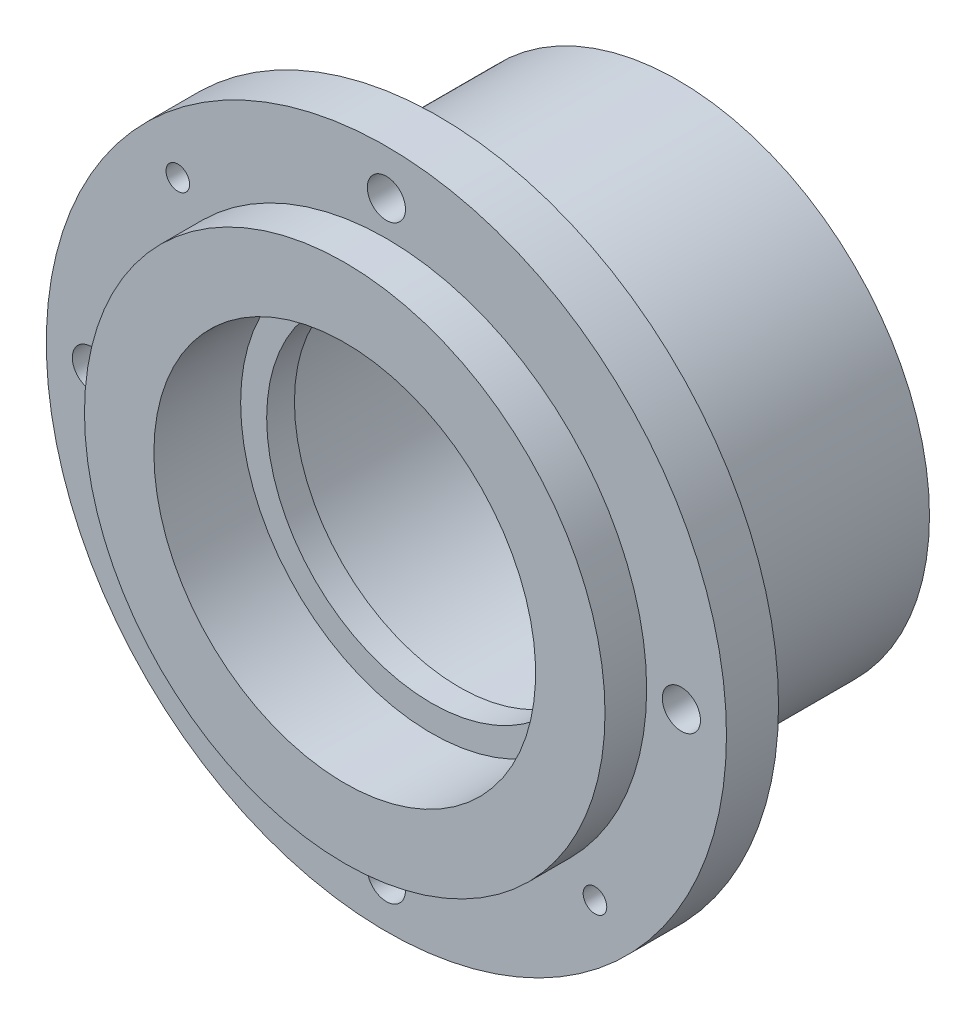
ISO-10303-21;
HEADER;
FILE_DESCRIPTION(('STEP AP214'),'2;1');
FILE_NAME('part.step','',(''),(''),'','','');
FILE_SCHEMA(('AUTOMOTIVE_DESIGN { 1 0 10303 214 1 1 1 1 }'));
ENDSEC;
DATA;
#1=APPLICATION_CONTEXT('core data for automotive mechanical design processes');
#2=APPLICATION_PROTOCOL_DEFINITION('international standard','automotive_design',2000,#1);
#3=PRODUCT_CONTEXT('',#1,'mechanical');
#4=PRODUCT('Part','Part','',(#3));
#5=PRODUCT_RELATED_PRODUCT_CATEGORY('part','',(#4));
#6=PRODUCT_DEFINITION_FORMATION('','',#4);
#7=PRODUCT_DEFINITION_CONTEXT('part definition',#1,'design');
#8=PRODUCT_DEFINITION('design','',#6,#7);
#9=PRODUCT_DEFINITION_SHAPE('','',#8);
#10=(LENGTH_UNIT() NAMED_UNIT(*) SI_UNIT(.MILLI.,.METRE.));
#11=(NAMED_UNIT(*) PLANE_ANGLE_UNIT() SI_UNIT($,.RADIAN.));
#12=(NAMED_UNIT(*) SI_UNIT($,.STERADIAN.) SOLID_ANGLE_UNIT());
#13=UNCERTAINTY_MEASURE_WITH_UNIT(LENGTH_MEASURE(1.E-05),#10,'distance_accuracy_value','');
#14=(GEOMETRIC_REPRESENTATION_CONTEXT(3) GLOBAL_UNCERTAINTY_ASSIGNED_CONTEXT((#13)) GLOBAL_UNIT_ASSIGNED_CONTEXT((#10,
#11,#12)) REPRESENTATION_CONTEXT('',''));
#15=CARTESIAN_POINT('',(0.,0.,0.));
#16=DIRECTION('',(0.,0.,1.));
#17=DIRECTION('',(1.,0.,0.));
#18=AXIS2_PLACEMENT_3D('',#15,#16,#17);
#19=CARTESIAN_POINT('',(0.,0.,20.));
#20=DIRECTION('',(0.,0.,-1.));
#21=DIRECTION('',(0.,-1.,0.));
#22=AXIS2_PLACEMENT_3D('',#19,#20,#21);
#23=PLANE('',#22);
#24=CARTESIAN_POINT('',(0.,0.,20.));
#25=DIRECTION('',(0.,0.,1.));
#26=DIRECTION('',(1.,0.,0.));
#27=AXIS2_PLACEMENT_3D('',#24,#25,#26);
#28=CIRCLE('',#27,55.);
#29=CARTESIAN_POINT('',(55.,0.,20.));
#30=VERTEX_POINT('',#29);
#31=EDGE_CURVE('E245',#30,#30,#28,.T.);
#32=ORIENTED_EDGE('',*,*,#31,.T.);
#33=EDGE_LOOP('',(#32));
#34=FACE_BOUND('',#33,.T.);
#35=CARTESIAN_POINT('',(0.,0.,20.));
#36=DIRECTION('',(0.,0.,1.));
#37=DIRECTION('',(1.,0.,0.));
#38=AXIS2_PLACEMENT_3D('',#35,#36,#37);
#39=CIRCLE('',#38,72.5);
#40=CARTESIAN_POINT('',(72.5,0.,20.));
#41=VERTEX_POINT('',#40);
#42=EDGE_CURVE('E255',#41,#41,#39,.T.);
#43=ORIENTED_EDGE('',*,*,#42,.F.);
#44=EDGE_LOOP('',(#43));
#45=FACE_BOUND('',#44,.T.);
#46=ADVANCED_FACE('F17',(#34,#45),#23,.T.);
#47=CARTESIAN_POINT('',(0.,0.,83.));
#48=DIRECTION('',(0.,0.,-1.));
#49=DIRECTION('',(0.,-1.,0.));
#50=AXIS2_PLACEMENT_3D('',#47,#48,#49);
#51=PLANE('',#50);
#52=CARTESIAN_POINT('',(0.,0.,83.));
#53=DIRECTION('',(0.,0.,-1.));
#54=DIRECTION('',(1.,0.,0.));
#55=AXIS2_PLACEMENT_3D('',#52,#53,#54);
#56=CIRCLE('',#55,47.5);
#57=CARTESIAN_POINT('',(47.5,0.,83.));
#58=VERTEX_POINT('',#57);
#59=EDGE_CURVE('E234',#58,#58,#56,.T.);
#60=ORIENTED_EDGE('',*,*,#59,.F.);
#61=EDGE_LOOP('',(#60));
#62=FACE_BOUND('',#61,.T.);
#63=CARTESIAN_POINT('',(0.,0.,83.));
#64=DIRECTION('',(0.,0.,-1.));
#65=DIRECTION('',(1.,0.,0.));
#66=AXIS2_PLACEMENT_3D('',#63,#64,#65);
#67=CIRCLE('',#66,55.);
#68=CARTESIAN_POINT('',(55.,0.,83.));
#69=VERTEX_POINT('',#68);
#70=EDGE_CURVE('E253',#69,#69,#67,.T.);
#71=ORIENTED_EDGE('',*,*,#70,.T.);
#72=EDGE_LOOP('',(#71));
#73=FACE_BOUND('',#72,.T.);
#74=ADVANCED_FACE('F281',(#62,#73),#51,.T.);
#75=CARTESIAN_POINT('',(0.,0.,89.));
#76=DIRECTION('',(0.,0.,-1.));
#77=DIRECTION('',(0.,-1.,0.));
#78=AXIS2_PLACEMENT_3D('',#75,#76,#77);
#79=PLANE('',#78);
#80=CARTESIAN_POINT('',(0.,0.,89.));
#81=DIRECTION('',(0.,0.,-1.));
#82=DIRECTION('',(-1.,0.,0.));
#83=AXIS2_PLACEMENT_3D('',#80,#81,#82);
#84=CIRCLE('',#83,72.5);
#85=CARTESIAN_POINT('',(72.5,0.,89.));
#86=VERTEX_POINT('',#85);
#87=EDGE_CURVE('E11',#86,#86,#84,.T.);
#88=ORIENTED_EDGE('',*,*,#87,.F.);
#89=EDGE_LOOP('',(#88));
#90=FACE_BOUND('',#89,.T.);
#91=CARTESIAN_POINT('',(0.,85.,89.));
#92=DIRECTION('',(0.,0.,-1.));
#93=DIRECTION('',(1.,0.,0.));
#94=AXIS2_PLACEMENT_3D('',#91,#92,#93);
#95=CIRCLE('',#94,5.5);
#96=CARTESIAN_POINT('',(5.5,85.,89.));
#97=VERTEX_POINT('',#96);
#98=EDGE_CURVE('E183',#97,#97,#95,.T.);
#99=ORIENTED_EDGE('',*,*,#98,.F.);
#100=EDGE_LOOP('',(#99));
#101=FACE_BOUND('',#100,.T.);
#102=CARTESIAN_POINT('',(85.,-5.93551827603332E-13,89.));
#103=DIRECTION('',(0.,0.,-1.));
#104=DIRECTION('',(1.,0.,0.));
#105=AXIS2_PLACEMENT_3D('',#102,#103,#104);
#106=CIRCLE('',#105,5.5);
#107=CARTESIAN_POINT('',(90.5,0.,89.));
#108=VERTEX_POINT('',#107);
#109=EDGE_CURVE('E148',#108,#108,#106,.T.);
#110=ORIENTED_EDGE('',*,*,#109,.F.);
#111=EDGE_LOOP('',(#110));
#112=FACE_BOUND('',#111,.T.);
#113=CARTESIAN_POINT('',(0.,-85.,89.));
#114=DIRECTION('',(0.,0.,-1.));
#115=DIRECTION('',(1.,0.,0.));
#116=AXIS2_PLACEMENT_3D('',#113,#114,#115);
#117=CIRCLE('',#116,5.5);
#118=CARTESIAN_POINT('',(5.5,-85.,89.));
#119=VERTEX_POINT('',#118);
#120=EDGE_CURVE('E161',#119,#119,#117,.T.);
#121=ORIENTED_EDGE('',*,*,#120,.F.);
#122=EDGE_LOOP('',(#121));
#123=FACE_BOUND('',#122,.T.);
#124=CARTESIAN_POINT('',(-85.,1.78065548281E-12,89.));
#125=DIRECTION('',(0.,0.,-1.));
#126=DIRECTION('',(1.,0.,0.));
#127=AXIS2_PLACEMENT_3D('',#124,#125,#126);
#128=CIRCLE('',#127,5.5);
#129=CARTESIAN_POINT('',(-79.5,0.,89.));
#130=VERTEX_POINT('',#129);
#131=EDGE_CURVE('E159',#130,#130,#128,.T.);
#132=ORIENTED_EDGE('',*,*,#131,.F.);
#133=EDGE_LOOP('',(#132));
#134=FACE_BOUND('',#133,.T.);
#135=CARTESIAN_POINT('',(-60.104076401,60.1040764007131,89.));
#136=DIRECTION('',(0.,0.,-1.));
#137=DIRECTION('',(1.,0.,0.));
#138=AXIS2_PLACEMENT_3D('',#135,#136,#137);
#139=CIRCLE('',#138,3.4);
#140=CARTESIAN_POINT('',(-56.704076401,60.104076401,89.));
#141=VERTEX_POINT('',#140);
#142=EDGE_CURVE('E144',#141,#141,#139,.T.);
#143=ORIENTED_EDGE('',*,*,#142,.F.);
#144=EDGE_LOOP('',(#143));
#145=FACE_BOUND('',#144,.T.);
#146=CARTESIAN_POINT('',(60.104076401,-60.1040764007128,89.));
#147=DIRECTION('',(0.,0.,-1.));
#148=DIRECTION('',(1.,0.,0.));
#149=AXIS2_PLACEMENT_3D('',#146,#147,#148);
#150=CIRCLE('',#149,3.4);
#151=CARTESIAN_POINT('',(63.504076401,-60.104076401,89.));
#152=VERTEX_POINT('',#151);
#153=EDGE_CURVE('E135',#152,#152,#150,.T.);
#154=ORIENTED_EDGE('',*,*,#153,.F.);
#155=EDGE_LOOP('',(#154));
#156=FACE_BOUND('',#155,.T.);
#157=CARTESIAN_POINT('',(0.,0.,89.));
#158=DIRECTION('',(0.,0.,-1.));
#159=DIRECTION('',(-1.,0.,0.));
#160=AXIS2_PLACEMENT_3D('',#157,#158,#159);
#161=CIRCLE('',#160,98.);
#162=CARTESIAN_POINT('',(98.,0.,89.));
#163=VERTEX_POINT('',#162);
#164=EDGE_CURVE('E223',#163,#163,#161,.T.);
#165=ORIENTED_EDGE('',*,*,#164,.T.);
#166=EDGE_LOOP('',(#165));
#167=FACE_BOUND('',#166,.T.);
#168=ADVANCED_FACE('F286',(#90,#101,#112,#123,#134,#145,#156,#167),#79,.T.);
#169=CARTESIAN_POINT('',(0.,0.,91.));
#170=DIRECTION('',(0.,0.,1.));
#171=DIRECTION('',(1.,0.,0.));
#172=AXIS2_PLACEMENT_3D('',#169,#170,#171);
#173=PLANE('',#172);
#174=CARTESIAN_POINT('',(0.,0.,91.));
#175=DIRECTION('',(0.,0.,1.));
#176=DIRECTION('',(1.,0.,0.));
#177=AXIS2_PLACEMENT_3D('',#174,#175,#176);
#178=CIRCLE('',#177,47.5);
#179=CARTESIAN_POINT('',(47.5,0.,91.));
#180=VERTEX_POINT('',#179);
#181=EDGE_CURVE('E242',#180,#180,#178,.T.);
#182=ORIENTED_EDGE('',*,*,#181,.F.);
#183=EDGE_LOOP('',(#182));
#184=FACE_BOUND('',#183,.T.);
#185=CARTESIAN_POINT('',(0.,0.,91.));
#186=DIRECTION('',(0.,0.,1.));
#187=DIRECTION('',(1.,0.,0.));
#188=AXIS2_PLACEMENT_3D('',#185,#186,#187);
#189=CIRCLE('',#188,55.);
#190=CARTESIAN_POINT('',(-55.,0.,91.));
#191=VERTEX_POINT('',#190);
#192=EDGE_CURVE('E175',#191,#191,#189,.T.);
#193=ORIENTED_EDGE('',*,*,#192,.T.);
#194=EDGE_LOOP('',(#193));
#195=FACE_BOUND('',#194,.T.);
#196=ADVANCED_FACE('F295',(#184,#195),#173,.T.);
#197=CARTESIAN_POINT('',(0.,0.,104.));
#198=DIRECTION('',(0.,0.,1.));
#199=DIRECTION('',(1.,0.,0.));
#200=AXIS2_PLACEMENT_3D('',#197,#198,#199);
#201=PLANE('',#200);
#202=CARTESIAN_POINT('',(0.,0.,104.));
#203=DIRECTION('',(0.,0.,1.));
#204=DIRECTION('',(1.,0.,0.));
#205=AXIS2_PLACEMENT_3D('',#202,#203,#204);
#206=CIRCLE('',#205,75.);
#207=CARTESIAN_POINT('',(-75.,0.,104.));
#208=VERTEX_POINT('',#207);
#209=EDGE_CURVE('E219',#208,#208,#206,.T.);
#210=ORIENTED_EDGE('',*,*,#209,.F.);
#211=EDGE_LOOP('',(#210));
#212=FACE_BOUND('',#211,.T.);
#213=CARTESIAN_POINT('',(0.,85.,104.));
#214=DIRECTION('',(0.,0.,1.));
#215=DIRECTION('',(1.,0.,0.));
#216=AXIS2_PLACEMENT_3D('',#213,#214,#215);
#217=CIRCLE('',#216,5.5);
#218=CARTESIAN_POINT('',(5.5,85.,104.));
#219=VERTEX_POINT('',#218);
#220=EDGE_CURVE('E203',#219,#219,#217,.T.);
#221=ORIENTED_EDGE('',*,*,#220,.F.);
#222=EDGE_LOOP('',(#221));
#223=FACE_BOUND('',#222,.T.);
#224=CARTESIAN_POINT('',(85.,0.,104.));
#225=DIRECTION('',(0.,0.,1.));
#226=DIRECTION('',(1.,0.,0.));
#227=AXIS2_PLACEMENT_3D('',#224,#225,#226);
#228=CIRCLE('',#227,5.5);
#229=CARTESIAN_POINT('',(90.5,0.,104.));
#230=VERTEX_POINT('',#229);
#231=EDGE_CURVE('E180',#230,#230,#228,.T.);
#232=ORIENTED_EDGE('',*,*,#231,.F.);
#233=EDGE_LOOP('',(#232));
#234=FACE_BOUND('',#233,.T.);
#235=CARTESIAN_POINT('',(0.,-85.,104.));
#236=DIRECTION('',(0.,0.,1.));
#237=DIRECTION('',(1.,0.,0.));
#238=AXIS2_PLACEMENT_3D('',#235,#236,#237);
#239=CIRCLE('',#238,5.5);
#240=CARTESIAN_POINT('',(5.5,-85.,104.));
#241=VERTEX_POINT('',#240);
#242=EDGE_CURVE('E151',#241,#241,#239,.T.);
#243=ORIENTED_EDGE('',*,*,#242,.F.);
#244=EDGE_LOOP('',(#243));
#245=FACE_BOUND('',#244,.T.);
#246=CARTESIAN_POINT('',(-85.,0.,104.));
#247=DIRECTION('',(0.,0.,1.));
#248=DIRECTION('',(1.,0.,0.));
#249=AXIS2_PLACEMENT_3D('',#246,#247,#248);
#250=CIRCLE('',#249,5.5);
#251=CARTESIAN_POINT('',(-79.5,0.,104.));
#252=VERTEX_POINT('',#251);
#253=EDGE_CURVE('E165',#252,#252,#250,.T.);
#254=ORIENTED_EDGE('',*,*,#253,.F.);
#255=EDGE_LOOP('',(#254));
#256=FACE_BOUND('',#255,.T.);
#257=CARTESIAN_POINT('',(-60.104076401,60.104076401,104.));
#258=DIRECTION('',(0.,0.,1.));
#259=DIRECTION('',(1.,0.,0.));
#260=AXIS2_PLACEMENT_3D('',#257,#258,#259);
#261=CIRCLE('',#260,3.4);
#262=CARTESIAN_POINT('',(-56.704076401,60.104076401,104.));
#263=VERTEX_POINT('',#262);
#264=EDGE_CURVE('E156',#263,#263,#261,.T.);
#265=ORIENTED_EDGE('',*,*,#264,.F.);
#266=EDGE_LOOP('',(#265));
#267=FACE_BOUND('',#266,.T.);
#268=CARTESIAN_POINT('',(60.104076401,-60.104076401,104.));
#269=DIRECTION('',(0.,0.,1.));
#270=DIRECTION('',(1.,0.,0.));
#271=AXIS2_PLACEMENT_3D('',#268,#269,#270);
#272=CIRCLE('',#271,3.4);
#273=CARTESIAN_POINT('',(63.504076401,-60.104076401,104.));
#274=VERTEX_POINT('',#273);
#275=EDGE_CURVE('E137',#274,#274,#272,.T.);
#276=ORIENTED_EDGE('',*,*,#275,.F.);
#277=EDGE_LOOP('',(#276));
#278=FACE_BOUND('',#277,.T.);
#279=CARTESIAN_POINT('',(0.,0.,104.));
#280=DIRECTION('',(0.,0.,1.));
#281=DIRECTION('',(1.,0.,0.));
#282=AXIS2_PLACEMENT_3D('',#279,#280,#281);
#283=CIRCLE('',#282,98.);
#284=CARTESIAN_POINT('',(98.,0.,104.));
#285=VERTEX_POINT('',#284);
#286=EDGE_CURVE('E231',#285,#285,#283,.T.);
#287=ORIENTED_EDGE('',*,*,#286,.T.);
#288=EDGE_LOOP('',(#287));
#289=FACE_BOUND('',#288,.T.);
#290=ADVANCED_FACE('F275',(#212,#223,#234,#245,#256,#267,#278,#289),#201,.T.);
#291=CARTESIAN_POINT('',(0.,0.,116.));
#292=DIRECTION('',(0.,0.,1.));
#293=DIRECTION('',(1.,0.,0.));
#294=AXIS2_PLACEMENT_3D('',#291,#292,#293);
#295=PLANE('',#294);
#296=CARTESIAN_POINT('',(0.,0.,116.));
#297=DIRECTION('',(0.,0.,1.));
#298=DIRECTION('',(1.,0.,0.));
#299=AXIS2_PLACEMENT_3D('',#296,#297,#298);
#300=CIRCLE('',#299,55.);
#301=CARTESIAN_POINT('',(-55.,0.,116.));
#302=VERTEX_POINT('',#301);
#303=EDGE_CURVE('E206',#302,#302,#300,.T.);
#304=ORIENTED_EDGE('',*,*,#303,.F.);
#305=EDGE_LOOP('',(#304));
#306=FACE_BOUND('',#305,.T.);
#307=CARTESIAN_POINT('',(0.,0.,116.));
#308=DIRECTION('',(0.,0.,1.));
#309=DIRECTION('',(1.,0.,0.));
#310=AXIS2_PLACEMENT_3D('',#307,#308,#309);
#311=CIRCLE('',#310,75.);
#312=CARTESIAN_POINT('',(-75.,0.,116.));
#313=VERTEX_POINT('',#312);
#314=EDGE_CURVE('E178',#313,#313,#311,.T.);
#315=ORIENTED_EDGE('',*,*,#314,.T.);
#316=EDGE_LOOP('',(#315));
#317=FACE_BOUND('',#316,.T.);
#318=ADVANCED_FACE('F265',(#306,#317),#295,.T.);
#319=CARTESIAN_POINT('',(0.,0.,54.5));
#320=DIRECTION('',(0.,0.,-1.));
#321=DIRECTION('',(-1.,0.,0.));
#322=AXIS2_PLACEMENT_3D('',#319,#320,#321);
#323=CYLINDRICAL_SURFACE('',#322,72.5);
#324=ORIENTED_EDGE('',*,*,#42,.T.);
#325=DIRECTION('',(0.,0.,1.));
#326=VECTOR('',#325,1.);
#327=CARTESIAN_POINT('',(72.5,0.,54.5));
#328=LINE('',#327,#326);
#329=EDGE_CURVE('E20',#41,#86,#328,.T.);
#330=ORIENTED_EDGE('',*,*,#329,.T.);
#331=ORIENTED_EDGE('',*,*,#87,.T.);
#332=ORIENTED_EDGE('',*,*,#329,.F.);
#333=EDGE_LOOP('',(#324,#330,#331,#332));
#334=FACE_BOUND('',#333,.T.);
#335=ADVANCED_FACE('F262',(#334),#323,.T.);
#336=CARTESIAN_POINT('',(0.,0.,51.5));
#337=DIRECTION('',(0.,0.,-1.));
#338=DIRECTION('',(-1.,0.,0.));
#339=AXIS2_PLACEMENT_3D('',#336,#337,#338);
#340=CYLINDRICAL_SURFACE('',#339,55.);
#341=ORIENTED_EDGE('',*,*,#31,.F.);
#342=DIRECTION('',(0.,0.,1.));
#343=VECTOR('',#342,1.);
#344=CARTESIAN_POINT('',(55.,0.,51.5));
#345=LINE('',#344,#343);
#346=EDGE_CURVE('E249',#30,#69,#345,.T.);
#347=ORIENTED_EDGE('',*,*,#346,.T.);
#348=ORIENTED_EDGE('',*,*,#70,.F.);
#349=ORIENTED_EDGE('',*,*,#346,.F.);
#350=EDGE_LOOP('',(#341,#347,#348,#349));
#351=FACE_BOUND('',#350,.T.);
#352=ADVANCED_FACE('F264',(#351),#340,.F.);
#353=CARTESIAN_POINT('',(0.,0.,87.));
#354=DIRECTION('',(0.,0.,-1.));
#355=DIRECTION('',(-1.,0.,0.));
#356=AXIS2_PLACEMENT_3D('',#353,#354,#355);
#357=CYLINDRICAL_SURFACE('',#356,47.5);
#358=ORIENTED_EDGE('',*,*,#59,.T.);
#359=DIRECTION('',(0.,0.,1.));
#360=VECTOR('',#359,1.);
#361=CARTESIAN_POINT('',(47.5,0.,87.));
#362=LINE('',#361,#360);
#363=EDGE_CURVE('E238',#58,#180,#362,.T.);
#364=ORIENTED_EDGE('',*,*,#363,.T.);
#365=ORIENTED_EDGE('',*,*,#181,.T.);
#366=ORIENTED_EDGE('',*,*,#363,.F.);
#367=EDGE_LOOP('',(#358,#364,#365,#366));
#368=FACE_BOUND('',#367,.T.);
#369=ADVANCED_FACE('F272',(#368),#357,.F.);
#370=CARTESIAN_POINT('',(0.,0.,96.5));
#371=DIRECTION('',(0.,0.,-1.));
#372=DIRECTION('',(-1.,0.,0.));
#373=AXIS2_PLACEMENT_3D('',#370,#371,#372);
#374=CYLINDRICAL_SURFACE('',#373,98.);
#375=ORIENTED_EDGE('',*,*,#164,.F.);
#376=DIRECTION('',(0.,0.,1.));
#377=VECTOR('',#376,1.);
#378=CARTESIAN_POINT('',(98.,0.,96.5));
#379=LINE('',#378,#377);
#380=EDGE_CURVE('E227',#163,#285,#379,.T.);
#381=ORIENTED_EDGE('',*,*,#380,.T.);
#382=ORIENTED_EDGE('',*,*,#286,.F.);
#383=ORIENTED_EDGE('',*,*,#380,.F.);
#384=EDGE_LOOP('',(#375,#381,#382,#383));
#385=FACE_BOUND('',#384,.T.);
#386=ADVANCED_FACE('F305',(#385),#374,.T.);
#387=CARTESIAN_POINT('',(0.,0.,110.));
#388=DIRECTION('',(0.,0.,1.));
#389=DIRECTION('',(1.,0.,0.));
#390=AXIS2_PLACEMENT_3D('',#387,#388,#389);
#391=CYLINDRICAL_SURFACE('',#390,75.);
#392=ORIENTED_EDGE('',*,*,#314,.F.);
#393=DIRECTION('',(0.,0.,-1.));
#394=VECTOR('',#393,1.);
#395=CARTESIAN_POINT('',(-75.,0.,110.));
#396=LINE('',#395,#394);
#397=EDGE_CURVE('E216',#313,#208,#396,.T.);
#398=ORIENTED_EDGE('',*,*,#397,.T.);
#399=ORIENTED_EDGE('',*,*,#209,.T.);
#400=ORIENTED_EDGE('',*,*,#397,.F.);
#401=EDGE_LOOP('',(#392,#398,#399,#400));
#402=FACE_BOUND('',#401,.T.);
#403=ADVANCED_FACE('F307',(#402),#391,.T.);
#404=CARTESIAN_POINT('',(0.,0.,103.5));
#405=DIRECTION('',(0.,0.,1.));
#406=DIRECTION('',(1.,0.,0.));
#407=AXIS2_PLACEMENT_3D('',#404,#405,#406);
#408=CYLINDRICAL_SURFACE('',#407,55.);
#409=ORIENTED_EDGE('',*,*,#303,.T.);
#410=DIRECTION('',(0.,0.,-1.));
#411=VECTOR('',#410,1.);
#412=CARTESIAN_POINT('',(-55.,0.,103.5));
#413=LINE('',#412,#411);
#414=EDGE_CURVE('E179',#302,#191,#413,.T.);
#415=ORIENTED_EDGE('',*,*,#414,.T.);
#416=ORIENTED_EDGE('',*,*,#192,.F.);
#417=ORIENTED_EDGE('',*,*,#414,.F.);
#418=EDGE_LOOP('',(#409,#415,#416,#417));
#419=FACE_BOUND('',#418,.T.);
#420=ADVANCED_FACE('F310',(#419),#408,.F.);
#421=CARTESIAN_POINT('',(0.,85.,96.5));
#422=DIRECTION('',(0.,0.,-1.));
#423=DIRECTION('',(-1.,0.,0.));
#424=AXIS2_PLACEMENT_3D('',#421,#422,#423);
#425=CYLINDRICAL_SURFACE('',#424,5.5);
#426=ORIENTED_EDGE('',*,*,#98,.T.);
#427=DIRECTION('',(0.,0.,1.));
#428=VECTOR('',#427,1.);
#429=CARTESIAN_POINT('',(5.5,85.,96.5));
#430=LINE('',#429,#428);
#431=EDGE_CURVE('E196',#97,#219,#430,.T.);
#432=ORIENTED_EDGE('',*,*,#431,.T.);
#433=ORIENTED_EDGE('',*,*,#220,.T.);
#434=ORIENTED_EDGE('',*,*,#431,.F.);
#435=EDGE_LOOP('',(#426,#432,#433,#434));
#436=FACE_BOUND('',#435,.T.);
#437=ADVANCED_FACE('F314',(#436),#425,.F.);
#438=CARTESIAN_POINT('',(85.,0.,96.5));
#439=DIRECTION('',(0.,0.,-1.));
#440=DIRECTION('',(-1.,0.,0.));
#441=AXIS2_PLACEMENT_3D('',#438,#439,#440);
#442=CYLINDRICAL_SURFACE('',#441,5.5);
#443=ORIENTED_EDGE('',*,*,#109,.T.);
#444=DIRECTION('',(0.,0.,1.));
#445=VECTOR('',#444,1.);
#446=CARTESIAN_POINT('',(90.5,0.,96.5));
#447=LINE('',#446,#445);
#448=EDGE_CURVE('E150',#108,#230,#447,.T.);
#449=ORIENTED_EDGE('',*,*,#448,.T.);
#450=ORIENTED_EDGE('',*,*,#231,.T.);
#451=ORIENTED_EDGE('',*,*,#448,.F.);
#452=EDGE_LOOP('',(#443,#449,#450,#451));
#453=FACE_BOUND('',#452,.T.);
#454=ADVANCED_FACE('F322',(#453),#442,.F.);
#455=CARTESIAN_POINT('',(0.,-85.,96.5));
#456=DIRECTION('',(0.,0.,-1.));
#457=DIRECTION('',(-1.,0.,0.));
#458=AXIS2_PLACEMENT_3D('',#455,#456,#457);
#459=CYLINDRICAL_SURFACE('',#458,5.5);
#460=ORIENTED_EDGE('',*,*,#120,.T.);
#461=DIRECTION('',(0.,0.,1.));
#462=VECTOR('',#461,1.);
#463=CARTESIAN_POINT('',(5.5,-85.,96.5));
#464=LINE('',#463,#462);
#465=EDGE_CURVE('E155',#119,#241,#464,.T.);
#466=ORIENTED_EDGE('',*,*,#465,.T.);
#467=ORIENTED_EDGE('',*,*,#242,.T.);
#468=ORIENTED_EDGE('',*,*,#465,.F.);
#469=EDGE_LOOP('',(#460,#466,#467,#468));
#470=FACE_BOUND('',#469,.T.);
#471=ADVANCED_FACE('F324',(#470),#459,.F.);
#472=CARTESIAN_POINT('',(-85.,0.,96.5));
#473=DIRECTION('',(0.,0.,-1.));
#474=DIRECTION('',(-1.,0.,0.));
#475=AXIS2_PLACEMENT_3D('',#472,#473,#474);
#476=CYLINDRICAL_SURFACE('',#475,5.5);
#477=ORIENTED_EDGE('',*,*,#131,.T.);
#478=DIRECTION('',(0.,0.,1.));
#479=VECTOR('',#478,1.);
#480=CARTESIAN_POINT('',(-79.5,0.,96.5));
#481=LINE('',#480,#479);
#482=EDGE_CURVE('E171',#130,#252,#481,.T.);
#483=ORIENTED_EDGE('',*,*,#482,.T.);
#484=ORIENTED_EDGE('',*,*,#253,.T.);
#485=ORIENTED_EDGE('',*,*,#482,.F.);
#486=EDGE_LOOP('',(#477,#483,#484,#485));
#487=FACE_BOUND('',#486,.T.);
#488=ADVANCED_FACE('F327',(#487),#476,.F.);
#489=CARTESIAN_POINT('',(-60.104076401,60.104076401,96.5));
#490=DIRECTION('',(0.,0.,-1.));
#491=DIRECTION('',(-1.,0.,0.));
#492=AXIS2_PLACEMENT_3D('',#489,#490,#491);
#493=CYLINDRICAL_SURFACE('',#492,3.4);
#494=ORIENTED_EDGE('',*,*,#142,.T.);
#495=DIRECTION('',(0.,0.,1.));
#496=VECTOR('',#495,1.);
#497=CARTESIAN_POINT('',(-56.704076401,60.104076401,96.5));
#498=LINE('',#497,#496);
#499=EDGE_CURVE('E160',#141,#263,#498,.T.);
#500=ORIENTED_EDGE('',*,*,#499,.T.);
#501=ORIENTED_EDGE('',*,*,#264,.T.);
#502=ORIENTED_EDGE('',*,*,#499,.F.);
#503=EDGE_LOOP('',(#494,#500,#501,#502));
#504=FACE_BOUND('',#503,.T.);
#505=ADVANCED_FACE('F332',(#504),#493,.F.);
#506=CARTESIAN_POINT('',(60.104076401,-60.104076401,96.5));
#507=DIRECTION('',(0.,0.,-1.));
#508=DIRECTION('',(-1.,0.,0.));
#509=AXIS2_PLACEMENT_3D('',#506,#507,#508);
#510=CYLINDRICAL_SURFACE('',#509,3.4);
#511=ORIENTED_EDGE('',*,*,#153,.T.);
#512=DIRECTION('',(0.,0.,1.));
#513=VECTOR('',#512,1.);
#514=CARTESIAN_POINT('',(63.504076401,-60.104076401,96.5));
#515=LINE('',#514,#513);
#516=EDGE_CURVE('E132',#152,#274,#515,.T.);
#517=ORIENTED_EDGE('',*,*,#516,.T.);
#518=ORIENTED_EDGE('',*,*,#275,.T.);
#519=ORIENTED_EDGE('',*,*,#516,.F.);
#520=EDGE_LOOP('',(#511,#517,#518,#519));
#521=FACE_BOUND('',#520,.T.);
#522=ADVANCED_FACE('F133',(#521),#510,.F.);
#523=CLOSED_SHELL('',(#46,#74,#168,#196,#290,#318,#335,#352,#369,#386,#403,#420,#437,#454,#471,
#488,#505,#522));
#524=MANIFOLD_SOLID_BREP('B1',#523);
#525=ADVANCED_BREP_SHAPE_REPRESENTATION('',(#18,#524),#14);
#526=SHAPE_DEFINITION_REPRESENTATION(#9,#525);
ENDSEC;
END-ISO-10303-21;
